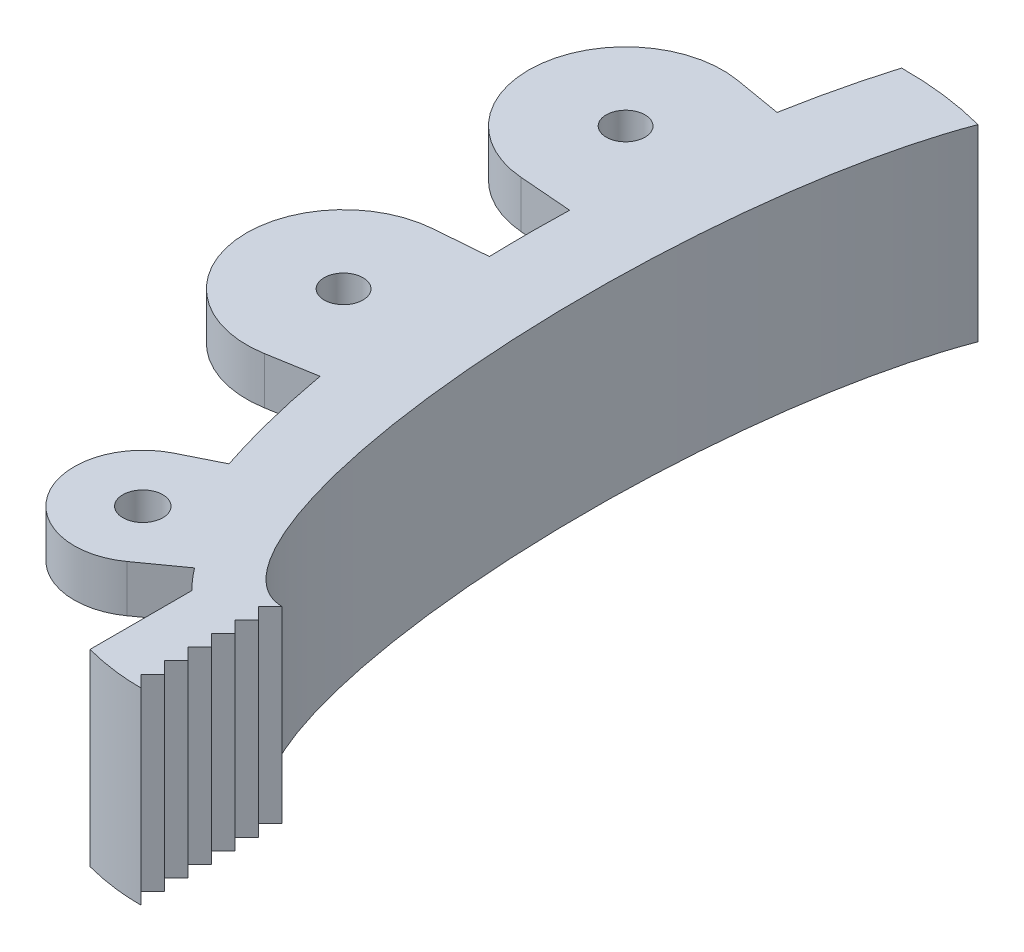
ISO-10303-21;
HEADER;
FILE_DESCRIPTION(('STEP AP214'),'2;1');
FILE_NAME('part.step','',(''),(''),'','','');
FILE_SCHEMA(('AUTOMOTIVE_DESIGN { 1 0 10303 214 1 1 1 1 }'));
ENDSEC;
DATA;
#1=APPLICATION_CONTEXT('core data for automotive mechanical design processes');
#2=APPLICATION_PROTOCOL_DEFINITION('international standard','automotive_design',2000,#1);
#3=PRODUCT_CONTEXT('',#1,'mechanical');
#4=PRODUCT('Part','Part','',(#3));
#5=PRODUCT_RELATED_PRODUCT_CATEGORY('part','',(#4));
#6=PRODUCT_DEFINITION_FORMATION('','',#4);
#7=PRODUCT_DEFINITION_CONTEXT('part definition',#1,'design');
#8=PRODUCT_DEFINITION('design','',#6,#7);
#9=PRODUCT_DEFINITION_SHAPE('','',#8);
#10=(LENGTH_UNIT() NAMED_UNIT(*) SI_UNIT(.MILLI.,.METRE.));
#11=(NAMED_UNIT(*) PLANE_ANGLE_UNIT() SI_UNIT($,.RADIAN.));
#12=(NAMED_UNIT(*) SI_UNIT($,.STERADIAN.) SOLID_ANGLE_UNIT());
#13=UNCERTAINTY_MEASURE_WITH_UNIT(LENGTH_MEASURE(1.E-05),#10,'distance_accuracy_value','');
#14=(GEOMETRIC_REPRESENTATION_CONTEXT(3) GLOBAL_UNCERTAINTY_ASSIGNED_CONTEXT((#13)) GLOBAL_UNIT_ASSIGNED_CONTEXT((#10,
#11,#12)) REPRESENTATION_CONTEXT('',''));
#15=CARTESIAN_POINT('',(0.,0.,0.));
#16=DIRECTION('',(0.,0.,1.));
#17=DIRECTION('',(1.,0.,0.));
#18=AXIS2_PLACEMENT_3D('',#15,#16,#17);
#19=CARTESIAN_POINT('',(0.,4.,0.));
#20=DIRECTION('',(0.,1.,0.));
#21=DIRECTION('',(0.,0.,1.));
#22=AXIS2_PLACEMENT_3D('',#19,#20,#21);
#23=PLANE('',#22);
#24=DIRECTION('',(0.812642963083128,0.,-0.582761884950855));
#25=VECTOR('',#24,1.);
#26=CARTESIAN_POINT('',(-9.89916446848209,4.,41.2779550383489));
#27=LINE('',#26,#25);
#28=CARTESIAN_POINT('',(-9.89916446847095,4.,41.2779550383645));
#29=VERTEX_POINT('',#28);
#30=CARTESIAN_POINT('',(-6.55408620010904,4.,38.8791351315237));
#31=VERTEX_POINT('',#30);
#32=EDGE_CURVE('E156',#29,#31,#27,.T.);
#33=ORIENTED_EDGE('',*,*,#32,.T.);
#34=CARTESIAN_POINT('',(2.02962646689286E-13,4.,2.));
#35=DIRECTION('',(0.,1.,0.));
#36=DIRECTION('',(0.,0.,1.));
#37=AXIS2_PLACEMENT_3D('',#34,#35,#36);
#38=ELLIPSE('',#37,41.,14.9999999999999);
#39=CARTESIAN_POINT('',(-5.00000000000001,4.,40.6551707048646));
#40=VERTEX_POINT('',#39);
#41=EDGE_CURVE('E385',#31,#40,#38,.T.);
#42=ORIENTED_EDGE('',*,*,#41,.T.);
#43=DIRECTION('',(0.,0.,1.));
#44=VECTOR('',#43,1.);
#45=CARTESIAN_POINT('',(-5.,4.,49.3275547212977));
#46=LINE('',#45,#44);
#47=CARTESIAN_POINT('',(-5.00000000000001,4.,49.3275547212978));
#48=VERTEX_POINT('',#47);
#49=EDGE_CURVE('E382',#40,#48,#46,.T.);
#50=ORIENTED_EDGE('',*,*,#49,.T.);
#51=CARTESIAN_POINT('',(2.02962646689286E-13,4.,2.));
#52=DIRECTION('',(0.,1.,0.));
#53=DIRECTION('',(0.,0.,1.));
#54=AXIS2_PLACEMENT_3D('',#51,#52,#53);
#55=ELLIPSE('',#54,48.,29.9759903923123);
#56=CARTESIAN_POINT('',(0.,4.,50.));
#57=VERTEX_POINT('',#56);
#58=EDGE_CURVE('E379',#48,#57,#55,.T.);
#59=ORIENTED_EDGE('',*,*,#58,.T.);
#60=DIRECTION('',(-0.707106781186547,0.,-0.707106781186548));
#61=VECTOR('',#60,1.);
#62=CARTESIAN_POINT('',(0.,4.,50.));
#63=LINE('',#62,#61);
#64=CARTESIAN_POINT('',(-1.,4.,49.));
#65=VERTEX_POINT('',#64);
#66=EDGE_CURVE('E376',#57,#65,#63,.T.);
#67=ORIENTED_EDGE('',*,*,#66,.T.);
#68=DIRECTION('',(0.707106781186547,0.,-0.707106781186548));
#69=VECTOR('',#68,1.);
#70=CARTESIAN_POINT('',(-1.,4.,49.));
#71=LINE('',#70,#69);
#72=CARTESIAN_POINT('',(0.,4.,48.));
#73=VERTEX_POINT('',#72);
#74=EDGE_CURVE('E373',#65,#73,#71,.T.);
#75=ORIENTED_EDGE('',*,*,#74,.T.);
#76=DIRECTION('',(-0.70710678118655,0.,-0.707106781186545));
#77=VECTOR('',#76,1.);
#78=CARTESIAN_POINT('',(0.,4.,48.));
#79=LINE('',#78,#77);
#80=CARTESIAN_POINT('',(-1.00000000000001,4.,47.));
#81=VERTEX_POINT('',#80);
#82=EDGE_CURVE('E370',#73,#81,#79,.T.);
#83=ORIENTED_EDGE('',*,*,#82,.T.);
#84=DIRECTION('',(0.707106781186547,0.,-0.707106781186548));
#85=VECTOR('',#84,1.);
#86=CARTESIAN_POINT('',(-1.00000000000001,4.,47.));
#87=LINE('',#86,#85);
#88=CARTESIAN_POINT('',(0.,4.,46.));
#89=VERTEX_POINT('',#88);
#90=EDGE_CURVE('E367',#81,#89,#87,.T.);
#91=ORIENTED_EDGE('',*,*,#90,.T.);
#92=DIRECTION('',(-0.707106781186552,0.,-0.707106781186543));
#93=VECTOR('',#92,1.);
#94=CARTESIAN_POINT('',(0.,4.,46.));
#95=LINE('',#94,#93);
#96=CARTESIAN_POINT('',(-1.00000000000002,4.,45.));
#97=VERTEX_POINT('',#96);
#98=EDGE_CURVE('E364',#89,#97,#95,.T.);
#99=ORIENTED_EDGE('',*,*,#98,.T.);
#100=DIRECTION('',(0.707106781186547,0.,-0.707106781186548));
#101=VECTOR('',#100,1.);
#102=CARTESIAN_POINT('',(-1.00000000000002,4.,45.));
#103=LINE('',#102,#101);
#104=CARTESIAN_POINT('',(0.,4.,44.));
#105=VERTEX_POINT('',#104);
#106=EDGE_CURVE('E361',#97,#105,#103,.T.);
#107=ORIENTED_EDGE('',*,*,#106,.T.);
#108=DIRECTION('',(-0.70710678118655,0.,-0.707106781186545));
#109=VECTOR('',#108,1.);
#110=CARTESIAN_POINT('',(0.,4.,44.));
#111=LINE('',#110,#109);
#112=CARTESIAN_POINT('',(-1.00000000000002,4.,43.));
#113=VERTEX_POINT('',#112);
#114=EDGE_CURVE('E358',#105,#113,#111,.T.);
#115=ORIENTED_EDGE('',*,*,#114,.T.);
#116=DIRECTION('',(0.707106781186547,0.,-0.707106781186548));
#117=VECTOR('',#116,1.);
#118=CARTESIAN_POINT('',(-1.00000000000002,4.,43.));
#119=LINE('',#118,#117);
#120=CARTESIAN_POINT('',(0.,4.,42.));
#121=VERTEX_POINT('',#120);
#122=EDGE_CURVE('E355',#113,#121,#119,.T.);
#123=ORIENTED_EDGE('',*,*,#122,.T.);
#124=DIRECTION('',(-0.70710678118655,0.,-0.707106781186545));
#125=VECTOR('',#124,1.);
#126=CARTESIAN_POINT('',(0.,4.,42.));
#127=LINE('',#126,#125);
#128=CARTESIAN_POINT('',(-1.00000000000003,4.,41.));
#129=VERTEX_POINT('',#128);
#130=EDGE_CURVE('E352',#121,#129,#127,.T.);
#131=ORIENTED_EDGE('',*,*,#130,.T.);
#132=DIRECTION('',(0.707106781186547,0.,-0.707106781186548));
#133=VECTOR('',#132,1.);
#134=CARTESIAN_POINT('',(-1.00000000000003,4.,41.));
#135=LINE('',#134,#133);
#136=CARTESIAN_POINT('',(0.,4.,40.));
#137=VERTEX_POINT('',#136);
#138=EDGE_CURVE('E349',#129,#137,#135,.T.);
#139=ORIENTED_EDGE('',*,*,#138,.T.);
#140=DIRECTION('',(-0.70710678118655,0.,-0.707106781186545));
#141=VECTOR('',#140,1.);
#142=CARTESIAN_POINT('',(0.,4.,40.));
#143=LINE('',#142,#141);
#144=CARTESIAN_POINT('',(-1.00000000000004,4.,39.));
#145=VERTEX_POINT('',#144);
#146=EDGE_CURVE('E346',#137,#145,#143,.T.);
#147=ORIENTED_EDGE('',*,*,#146,.T.);
#148=DIRECTION('',(0.707106781186566,0.,-0.707106781186529));
#149=VECTOR('',#148,1.);
#150=CARTESIAN_POINT('',(-1.00000000000004,4.,39.));
#151=LINE('',#150,#149);
#152=CARTESIAN_POINT('',(0.,4.,38.));
#153=VERTEX_POINT('',#152);
#154=EDGE_CURVE('E343',#145,#153,#151,.T.);
#155=ORIENTED_EDGE('',*,*,#154,.T.);
#156=CARTESIAN_POINT('',(2.02962646689286E-13,4.,2.));
#157=DIRECTION('',(0.,-1.,0.));
#158=DIRECTION('',(0.,0.,1.));
#159=AXIS2_PLACEMENT_3D('',#156,#157,#158);
#160=ELLIPSE('',#159,36.,10.);
#161=CARTESIAN_POINT('',(-5.89365223515134,4.,-27.0832018314858));
#162=VERTEX_POINT('',#161);
#163=EDGE_CURVE('E340',#153,#162,#160,.T.);
#164=ORIENTED_EDGE('',*,*,#163,.T.);
#165=CARTESIAN_POINT('',(-13.,4.,4.50401092710764E-13));
#166=DIRECTION('',(0.,1.,0.));
#167=DIRECTION('',(0.,0.,1.));
#168=AXIS2_PLACEMENT_3D('',#165,#166,#167);
#169=CIRCLE('',#168,28.0000000000178);
#170=CARTESIAN_POINT('',(-13.3088025963939,4.,-27.9982971081713));
#171=VERTEX_POINT('',#170);
#172=EDGE_CURVE('E108',#162,#171,#169,.T.);
#173=ORIENTED_EDGE('',*,*,#172,.T.);
#174=CARTESIAN_POINT('',(0.,4.,0.));
#175=DIRECTION('',(0.,1.,0.));
#176=DIRECTION('',(0.,0.,1.));
#177=AXIS2_PLACEMENT_3D('',#174,#175,#176);
#178=ELLIPSE('',#177,45.,17.);
#179=CARTESIAN_POINT('',(-15.3330618466495,4.,-19.4333088266233));
#180=VERTEX_POINT('',#179);
#181=EDGE_CURVE('E217',#171,#180,#178,.T.);
#182=ORIENTED_EDGE('',*,*,#181,.T.);
#183=DIRECTION('',(-0.985692604134485,0.,-0.168552929830889));
#184=VECTOR('',#183,1.);
#185=CARTESIAN_POINT('',(-19.381931406796,4.,-20.1256634450949));
#186=LINE('',#185,#184);
#187=CARTESIAN_POINT('',(-19.381931406796,4.,-20.1256634450949));
#188=VERTEX_POINT('',#187);
#189=EDGE_CURVE('E239',#180,#188,#186,.T.);
#190=ORIENTED_EDGE('',*,*,#189,.T.);
#191=CARTESIAN_POINT('',(-20.7726012422298,4.,-11.99306691897));
#192=DIRECTION('',(0.,1.,0.));
#193=DIRECTION('',(0.,0.,1.));
#194=AXIS2_PLACEMENT_3D('',#191,#192,#193);
#195=CIRCLE('',#194,8.25064172339411);
#196=CARTESIAN_POINT('',(-21.4292742813688,4.,-3.76859919348893));
#197=VERTEX_POINT('',#196);
#198=EDGE_CURVE('E236',#188,#197,#195,.T.);
#199=ORIENTED_EDGE('',*,*,#198,.T.);
#200=DIRECTION('',(0.996827640953239,0.,0.0795905410937763));
#201=VECTOR('',#200,1.);
#202=CARTESIAN_POINT('',(-21.4292742813682,4.,-3.76859919349572));
#203=LINE('',#202,#201);
#204=CARTESIAN_POINT('',(-16.9510904478519,4.,-3.41104382506098));
#205=VERTEX_POINT('',#204);
#206=EDGE_CURVE('E238',#197,#205,#203,.T.);
#207=ORIENTED_EDGE('',*,*,#206,.T.);
#208=CARTESIAN_POINT('',(0.,4.,0.));
#209=DIRECTION('',(0.,1.,0.));
#210=DIRECTION('',(0.,0.,1.));
#211=AXIS2_PLACEMENT_3D('',#208,#209,#210);
#212=ELLIPSE('',#211,45.,17.);
#213=CARTESIAN_POINT('',(-16.9510904478519,4.,3.41104382506229));
#214=VERTEX_POINT('',#213);
#215=EDGE_CURVE('E241',#205,#214,#212,.T.);
#216=ORIENTED_EDGE('',*,*,#215,.T.);
#217=DIRECTION('',(-0.996827640953238,0.,0.0795905410937935));
#218=VECTOR('',#217,1.);
#219=CARTESIAN_POINT('',(-21.4292742813682,4.,3.7685991934971));
#220=LINE('',#219,#218);
#221=CARTESIAN_POINT('',(-21.4292742813682,4.,3.7685991934971));
#222=VERTEX_POINT('',#221);
#223=EDGE_CURVE('E248',#214,#222,#220,.T.);
#224=ORIENTED_EDGE('',*,*,#223,.T.);
#225=CARTESIAN_POINT('',(-20.7726012422296,4.,11.9930669189713));
#226=DIRECTION('',(0.,1.,0.));
#227=DIRECTION('',(0.,0.,1.));
#228=AXIS2_PLACEMENT_3D('',#225,#226,#227);
#229=CIRCLE('',#228,8.25064172339408);
#230=CARTESIAN_POINT('',(-19.3819314067968,4.,20.1256634450895));
#231=VERTEX_POINT('',#230);
#232=EDGE_CURVE('E577',#222,#231,#229,.T.);
#233=ORIENTED_EDGE('',*,*,#232,.T.);
#234=DIRECTION('',(0.985692604134482,0.,-0.16855292983091));
#235=VECTOR('',#234,1.);
#236=CARTESIAN_POINT('',(-19.3819314067957,4.,20.1256634450962));
#237=LINE('',#236,#235);
#238=CARTESIAN_POINT('',(-15.3330618466493,4.,19.4333088266245));
#239=VERTEX_POINT('',#238);
#240=EDGE_CURVE('E142',#231,#239,#237,.T.);
#241=ORIENTED_EDGE('',*,*,#240,.T.);
#242=CARTESIAN_POINT('',(0.,4.,0.));
#243=DIRECTION('',(0.,1.,0.));
#244=DIRECTION('',(0.,0.,1.));
#245=AXIS2_PLACEMENT_3D('',#242,#243,#244);
#246=ELLIPSE('',#245,45.,17.);
#247=CARTESIAN_POINT('',(-12.7538354502232,4.,29.753186253147));
#248=VERTEX_POINT('',#247);
#249=EDGE_CURVE('E136',#239,#248,#246,.T.);
#250=ORIENTED_EDGE('',*,*,#249,.T.);
#251=DIRECTION('',(-0.89554192965908,0.,0.444977136741306));
#252=VECTOR('',#251,1.);
#253=CARTESIAN_POINT('',(-15.8942706000473,4.,31.3136065917261));
#254=LINE('',#253,#252);
#255=CARTESIAN_POINT('',(-15.8942706000473,4.,31.3136065917261));
#256=VERTEX_POINT('',#255);
#257=EDGE_CURVE('E140',#248,#256,#254,.T.);
#258=ORIENTED_EDGE('',*,*,#257,.T.);
#259=CARTESIAN_POINT('',(-13.2985871584458,4.,36.5375679284797));
#260=DIRECTION('',(0.,1.,0.));
#261=DIRECTION('',(0.,0.,1.));
#262=AXIS2_PLACEMENT_3D('',#259,#260,#261);
#263=CIRCLE('',#262,5.83329620169225);
#264=EDGE_CURVE('E52',#256,#29,#263,.T.);
#265=ORIENTED_EDGE('',*,*,#264,.T.);
#266=EDGE_LOOP('',(#33,#42,#50,#59,#67,#75,#83,#91,#99,#107,#115,#123,#131,#139,#147,#155,#164,
#173,#182,#190,#199,#207,#216,#224,#233,#241,#250,#258,#265));
#267=FACE_BOUND('',#266,.T.);
#268=CARTESIAN_POINT('',(-20.7726012422298,4.,-11.99306691897));
#269=DIRECTION('',(0.,1.,0.));
#270=DIRECTION('',(0.,0.,1.));
#271=AXIS2_PLACEMENT_3D('',#268,#269,#270);
#272=CIRCLE('',#271,1.65000000000002);
#273=CARTESIAN_POINT('',(-20.7726012422298,4.,-10.34306691897));
#274=VERTEX_POINT('',#273);
#275=EDGE_CURVE('E272',#274,#274,#272,.T.);
#276=ORIENTED_EDGE('',*,*,#275,.F.);
#277=EDGE_LOOP('',(#276));
#278=FACE_BOUND('',#277,.T.);
#279=CARTESIAN_POINT('',(-13.2985871584458,4.,36.5375679284797));
#280=DIRECTION('',(0.,1.,0.));
#281=DIRECTION('',(0.,0.,1.));
#282=AXIS2_PLACEMENT_3D('',#279,#280,#281);
#283=CIRCLE('',#282,1.7);
#284=CARTESIAN_POINT('',(-13.2985871584458,4.,38.2375679284797));
#285=VERTEX_POINT('',#284);
#286=EDGE_CURVE('E166',#285,#285,#283,.T.);
#287=ORIENTED_EDGE('',*,*,#286,.F.);
#288=EDGE_LOOP('',(#287));
#289=FACE_BOUND('',#288,.T.);
#290=CARTESIAN_POINT('',(-20.7726012422296,4.,11.9930669189713));
#291=DIRECTION('',(0.,1.,0.));
#292=DIRECTION('',(0.,0.,1.));
#293=AXIS2_PLACEMENT_3D('',#290,#291,#292);
#294=CIRCLE('',#293,1.65000000000018);
#295=CARTESIAN_POINT('',(-20.7726012422296,4.,13.6430669189715));
#296=VERTEX_POINT('',#295);
#297=EDGE_CURVE('E278',#296,#296,#294,.T.);
#298=ORIENTED_EDGE('',*,*,#297,.F.);
#299=EDGE_LOOP('',(#298));
#300=FACE_BOUND('',#299,.T.);
#301=ADVANCED_FACE('F35',(#267,#278,#289,#300),#23,.T.);
#302=CARTESIAN_POINT('',(0.,0.,0.));
#303=DIRECTION('',(0.,1.,0.));
#304=DIRECTION('',(0.,0.,1.));
#305=AXIS2_PLACEMENT_3D('',#302,#303,#304);
#306=PLANE('',#305);
#307=CARTESIAN_POINT('',(-13.,0.,4.50401092710764E-13));
#308=DIRECTION('',(0.,1.,0.));
#309=DIRECTION('',(0.,0.,1.));
#310=AXIS2_PLACEMENT_3D('',#307,#308,#309);
#311=CIRCLE('',#310,28.0000000000178);
#312=CARTESIAN_POINT('',(-10.2761925182706,0.,-27.867200663189));
#313=VERTEX_POINT('',#312);
#314=CARTESIAN_POINT('',(-13.3088025963939,0.,-27.9982971081713));
#315=VERTEX_POINT('',#314);
#316=EDGE_CURVE('E163',#313,#315,#311,.T.);
#317=ORIENTED_EDGE('',*,*,#316,.F.);
#318=CARTESIAN_POINT('',(2.02962646689286E-13,0.,2.));
#319=DIRECTION('',(0.,1.,0.));
#320=DIRECTION('',(0.,0.,1.));
#321=AXIS2_PLACEMENT_3D('',#318,#319,#320);
#322=ELLIPSE('',#321,41.,14.9999999999999);
#323=CARTESIAN_POINT('',(-6.55408620010904,0.,38.8791351315237));
#324=VERTEX_POINT('',#323);
#325=EDGE_CURVE('E284',#313,#324,#322,.T.);
#326=ORIENTED_EDGE('',*,*,#325,.T.);
#327=DIRECTION('',(0.812642963083128,0.,-0.582761884950855));
#328=VECTOR('',#327,1.);
#329=CARTESIAN_POINT('',(-9.89916446848209,0.,41.2779550383489));
#330=LINE('',#329,#328);
#331=CARTESIAN_POINT('',(-9.89916446847095,0.,41.2779550383645));
#332=VERTEX_POINT('',#331);
#333=EDGE_CURVE('E185',#332,#324,#330,.T.);
#334=ORIENTED_EDGE('',*,*,#333,.F.);
#335=CARTESIAN_POINT('',(-13.2985871584458,0.,36.5375679284797));
#336=DIRECTION('',(0.,1.,0.));
#337=DIRECTION('',(0.,0.,1.));
#338=AXIS2_PLACEMENT_3D('',#335,#336,#337);
#339=CIRCLE('',#338,5.83329620169225);
#340=CARTESIAN_POINT('',(-15.8942706000473,0.,31.3136065917261));
#341=VERTEX_POINT('',#340);
#342=EDGE_CURVE('E100',#341,#332,#339,.T.);
#343=ORIENTED_EDGE('',*,*,#342,.F.);
#344=DIRECTION('',(-0.89554192965908,0.,0.444977136741306));
#345=VECTOR('',#344,1.);
#346=CARTESIAN_POINT('',(-15.8942706000473,0.,31.3136065917261));
#347=LINE('',#346,#345);
#348=CARTESIAN_POINT('',(-12.7538354502232,0.,29.753186253147));
#349=VERTEX_POINT('',#348);
#350=EDGE_CURVE('E94',#349,#341,#347,.T.);
#351=ORIENTED_EDGE('',*,*,#350,.F.);
#352=CARTESIAN_POINT('',(0.,0.,0.));
#353=DIRECTION('',(0.,1.,0.));
#354=DIRECTION('',(0.,0.,1.));
#355=AXIS2_PLACEMENT_3D('',#352,#353,#354);
#356=ELLIPSE('',#355,45.,17.);
#357=CARTESIAN_POINT('',(-15.3330618466493,0.,19.4333088266245));
#358=VERTEX_POINT('',#357);
#359=EDGE_CURVE('E150',#358,#349,#356,.T.);
#360=ORIENTED_EDGE('',*,*,#359,.F.);
#361=DIRECTION('',(0.985692604134482,0.,-0.16855292983091));
#362=VECTOR('',#361,1.);
#363=CARTESIAN_POINT('',(-19.3819314067957,0.,20.1256634450962));
#364=LINE('',#363,#362);
#365=CARTESIAN_POINT('',(-19.3819314067968,0.,20.1256634450895));
#366=VERTEX_POINT('',#365);
#367=EDGE_CURVE('E180',#366,#358,#364,.T.);
#368=ORIENTED_EDGE('',*,*,#367,.F.);
#369=CARTESIAN_POINT('',(-20.7726012422296,0.,11.9930669189713));
#370=DIRECTION('',(0.,1.,0.));
#371=DIRECTION('',(0.,0.,1.));
#372=AXIS2_PLACEMENT_3D('',#369,#370,#371);
#373=CIRCLE('',#372,8.25064172339408);
#374=CARTESIAN_POINT('',(-21.4292742813682,0.,3.7685991934971));
#375=VERTEX_POINT('',#374);
#376=EDGE_CURVE('E178',#375,#366,#373,.T.);
#377=ORIENTED_EDGE('',*,*,#376,.F.);
#378=DIRECTION('',(-0.996827640953238,0.,0.0795905410937935));
#379=VECTOR('',#378,1.);
#380=CARTESIAN_POINT('',(-21.4292742813682,0.,3.7685991934971));
#381=LINE('',#380,#379);
#382=CARTESIAN_POINT('',(-16.9510904478519,0.,3.41104382506229));
#383=VERTEX_POINT('',#382);
#384=EDGE_CURVE('E176',#383,#375,#381,.T.);
#385=ORIENTED_EDGE('',*,*,#384,.F.);
#386=CARTESIAN_POINT('',(0.,0.,0.));
#387=DIRECTION('',(0.,1.,0.));
#388=DIRECTION('',(0.,0.,1.));
#389=AXIS2_PLACEMENT_3D('',#386,#387,#388);
#390=ELLIPSE('',#389,45.,17.);
#391=CARTESIAN_POINT('',(-16.9510904478519,0.,-3.41104382506098));
#392=VERTEX_POINT('',#391);
#393=EDGE_CURVE('E174',#392,#383,#390,.T.);
#394=ORIENTED_EDGE('',*,*,#393,.F.);
#395=DIRECTION('',(0.996827640953239,0.,0.0795905410937763));
#396=VECTOR('',#395,1.);
#397=CARTESIAN_POINT('',(-21.4292742813682,0.,-3.76859919349572));
#398=LINE('',#397,#396);
#399=CARTESIAN_POINT('',(-21.4292742813688,0.,-3.76859919348893));
#400=VERTEX_POINT('',#399);
#401=EDGE_CURVE('E172',#400,#392,#398,.T.);
#402=ORIENTED_EDGE('',*,*,#401,.F.);
#403=CARTESIAN_POINT('',(-20.7726012422298,0.,-11.99306691897));
#404=DIRECTION('',(0.,1.,0.));
#405=DIRECTION('',(0.,0.,1.));
#406=AXIS2_PLACEMENT_3D('',#403,#404,#405);
#407=CIRCLE('',#406,8.25064172339411);
#408=CARTESIAN_POINT('',(-19.381931406796,0.,-20.1256634450949));
#409=VERTEX_POINT('',#408);
#410=EDGE_CURVE('E170',#409,#400,#407,.T.);
#411=ORIENTED_EDGE('',*,*,#410,.F.);
#412=DIRECTION('',(-0.985692604134485,0.,-0.168552929830889));
#413=VECTOR('',#412,1.);
#414=CARTESIAN_POINT('',(-19.381931406796,0.,-20.1256634450949));
#415=LINE('',#414,#413);
#416=CARTESIAN_POINT('',(-15.3330618466495,0.,-19.4333088266233));
#417=VERTEX_POINT('',#416);
#418=EDGE_CURVE('E168',#417,#409,#415,.T.);
#419=ORIENTED_EDGE('',*,*,#418,.F.);
#420=CARTESIAN_POINT('',(0.,0.,0.));
#421=DIRECTION('',(0.,1.,0.));
#422=DIRECTION('',(0.,0.,1.));
#423=AXIS2_PLACEMENT_3D('',#420,#421,#422);
#424=ELLIPSE('',#423,45.,17.);
#425=EDGE_CURVE('E165',#315,#417,#424,.T.);
#426=ORIENTED_EDGE('',*,*,#425,.F.);
#427=EDGE_LOOP('',(#317,#326,#334,#343,#351,#360,#368,#377,#385,#394,#402,#411,#419,#426));
#428=FACE_BOUND('',#427,.T.);
#429=CARTESIAN_POINT('',(-13.2985871584458,0.,36.5375679284797));
#430=DIRECTION('',(0.,1.,0.));
#431=DIRECTION('',(0.,0.,1.));
#432=AXIS2_PLACEMENT_3D('',#429,#430,#431);
#433=CIRCLE('',#432,1.7);
#434=CARTESIAN_POINT('',(-13.2985871584458,0.,38.2375679284797));
#435=VERTEX_POINT('',#434);
#436=EDGE_CURVE('E269',#435,#435,#433,.T.);
#437=ORIENTED_EDGE('',*,*,#436,.T.);
#438=EDGE_LOOP('',(#437));
#439=FACE_BOUND('',#438,.T.);
#440=CARTESIAN_POINT('',(-20.7726012422298,0.,-11.99306691897));
#441=DIRECTION('',(0.,1.,0.));
#442=DIRECTION('',(0.,0.,1.));
#443=AXIS2_PLACEMENT_3D('',#440,#441,#442);
#444=CIRCLE('',#443,1.65000000000002);
#445=CARTESIAN_POINT('',(-20.7726012422298,0.,-10.34306691897));
#446=VERTEX_POINT('',#445);
#447=EDGE_CURVE('E275',#446,#446,#444,.T.);
#448=ORIENTED_EDGE('',*,*,#447,.T.);
#449=EDGE_LOOP('',(#448));
#450=FACE_BOUND('',#449,.T.);
#451=CARTESIAN_POINT('',(-20.7726012422296,0.,11.9930669189713));
#452=DIRECTION('',(0.,1.,0.));
#453=DIRECTION('',(0.,0.,1.));
#454=AXIS2_PLACEMENT_3D('',#451,#452,#453);
#455=CIRCLE('',#454,1.65000000000018);
#456=CARTESIAN_POINT('',(-20.7726012422296,0.,13.6430669189715));
#457=VERTEX_POINT('',#456);
#458=EDGE_CURVE('E281',#457,#457,#455,.T.);
#459=ORIENTED_EDGE('',*,*,#458,.T.);
#460=EDGE_LOOP('',(#459));
#461=FACE_BOUND('',#460,.T.);
#462=ADVANCED_FACE('F222',(#428,#439,#450,#461),#306,.F.);
#463=CARTESIAN_POINT('',(-13.,4.,4.50401092710764E-13));
#464=DIRECTION('',(0.,-1.,0.));
#465=DIRECTION('',(0.,0.,-1.));
#466=AXIS2_PLACEMENT_3D('',#463,#464,#465);
#467=CYLINDRICAL_SURFACE('',#466,28.0000000000178);
#468=DIRECTION('',(0.,1.,0.));
#469=VECTOR('',#468,1.);
#470=CARTESIAN_POINT('',(-10.2761925182706,-12.,-27.867200663189));
#471=LINE('',#470,#469);
#472=CARTESIAN_POINT('',(-10.2761925182706,-12.,-27.867200663189));
#473=VERTEX_POINT('',#472);
#474=EDGE_CURVE('E288',#473,#313,#471,.T.);
#475=ORIENTED_EDGE('',*,*,#474,.T.);
#476=ORIENTED_EDGE('',*,*,#316,.T.);
#477=DIRECTION('',(0.,-1.,0.));
#478=VECTOR('',#477,1.);
#479=CARTESIAN_POINT('',(-13.3088025963939,4.,-27.9982971081713));
#480=LINE('',#479,#478);
#481=EDGE_CURVE('E44',#171,#315,#480,.T.);
#482=ORIENTED_EDGE('',*,*,#481,.F.);
#483=ORIENTED_EDGE('',*,*,#172,.F.);
#484=DIRECTION('',(0.,1.,0.));
#485=VECTOR('',#484,1.);
#486=CARTESIAN_POINT('',(-5.89365223515134,-12.,-27.0832018314858));
#487=LINE('',#486,#485);
#488=CARTESIAN_POINT('',(-5.89365223515134,-12.,-27.0832018314858));
#489=VERTEX_POINT('',#488);
#490=EDGE_CURVE('E335',#489,#162,#487,.T.);
#491=ORIENTED_EDGE('',*,*,#490,.F.);
#492=CARTESIAN_POINT('',(-13.,-12.,4.50401092710764E-13));
#493=DIRECTION('',(0.,1.,0.));
#494=DIRECTION('',(0.,0.,-1.));
#495=AXIS2_PLACEMENT_3D('',#492,#493,#494);
#496=CIRCLE('',#495,27.9999999999998);
#497=EDGE_CURVE('E293',#489,#473,#496,.T.);
#498=ORIENTED_EDGE('',*,*,#497,.T.);
#499=EDGE_LOOP('',(#475,#476,#482,#483,#491,#498));
#500=FACE_BOUND('',#499,.T.);
#501=ADVANCED_FACE('F37',(#500),#467,.T.);
#502=DIRECTION('',(0.,-1.,0.));
#503=VECTOR('',#502,1.);
#504=SURFACE_OF_LINEAR_EXTRUSION('',#178,#503);
#505=ORIENTED_EDGE('',*,*,#425,.T.);
#506=DIRECTION('',(0.,-1.,0.));
#507=VECTOR('',#506,1.);
#508=CARTESIAN_POINT('',(-15.3330618466495,4.,-19.4333088266233));
#509=LINE('',#508,#507);
#510=EDGE_CURVE('E209',#180,#417,#509,.T.);
#511=ORIENTED_EDGE('',*,*,#510,.F.);
#512=ORIENTED_EDGE('',*,*,#181,.F.);
#513=ORIENTED_EDGE('',*,*,#481,.T.);
#514=EDGE_LOOP('',(#505,#511,#512,#513));
#515=FACE_BOUND('',#514,.T.);
#516=ADVANCED_FACE('F215',(#515),#504,.F.);
#517=CARTESIAN_POINT('',(-19.381931406796,4.,-20.1256634450949));
#518=DIRECTION('',(-0.168552929830889,0.,0.985692604134485));
#519=DIRECTION('',(0.985692604134486,0.,0.168552929830889));
#520=AXIS2_PLACEMENT_3D('',#517,#518,#519);
#521=PLANE('',#520);
#522=ORIENTED_EDGE('',*,*,#418,.T.);
#523=DIRECTION('',(0.,-1.,0.));
#524=VECTOR('',#523,1.);
#525=CARTESIAN_POINT('',(-19.381931406796,4.,-20.1256634450949));
#526=LINE('',#525,#524);
#527=EDGE_CURVE('E206',#188,#409,#526,.T.);
#528=ORIENTED_EDGE('',*,*,#527,.F.);
#529=ORIENTED_EDGE('',*,*,#189,.F.);
#530=ORIENTED_EDGE('',*,*,#510,.T.);
#531=EDGE_LOOP('',(#522,#528,#529,#530));
#532=FACE_BOUND('',#531,.T.);
#533=ADVANCED_FACE('F230',(#532),#521,.F.);
#534=CARTESIAN_POINT('',(-20.7726012422298,4.,-11.99306691897));
#535=DIRECTION('',(0.,-1.,0.));
#536=DIRECTION('',(0.,0.,-1.));
#537=AXIS2_PLACEMENT_3D('',#534,#535,#536);
#538=CYLINDRICAL_SURFACE('',#537,8.25064172339411);
#539=ORIENTED_EDGE('',*,*,#410,.T.);
#540=DIRECTION('',(0.,-1.,0.));
#541=VECTOR('',#540,1.);
#542=CARTESIAN_POINT('',(-21.4292742813688,4.,-3.76859919348893));
#543=LINE('',#542,#541);
#544=EDGE_CURVE('E203',#197,#400,#543,.T.);
#545=ORIENTED_EDGE('',*,*,#544,.F.);
#546=ORIENTED_EDGE('',*,*,#198,.F.);
#547=ORIENTED_EDGE('',*,*,#527,.T.);
#548=EDGE_LOOP('',(#539,#545,#546,#547));
#549=FACE_BOUND('',#548,.T.);
#550=ADVANCED_FACE('F234',(#549),#538,.T.);
#551=CARTESIAN_POINT('',(-21.4292742813682,4.,-3.76859919349572));
#552=DIRECTION('',(0.0795905410937763,0.,-0.996827640953239));
#553=DIRECTION('',(-0.996827640953239,0.,-0.0795905410937763));
#554=AXIS2_PLACEMENT_3D('',#551,#552,#553);
#555=PLANE('',#554);
#556=ORIENTED_EDGE('',*,*,#401,.T.);
#557=DIRECTION('',(0.,-1.,0.));
#558=VECTOR('',#557,1.);
#559=CARTESIAN_POINT('',(-16.9510904478519,4.,-3.41104382506098));
#560=LINE('',#559,#558);
#561=EDGE_CURVE('E200',#205,#392,#560,.T.);
#562=ORIENTED_EDGE('',*,*,#561,.F.);
#563=ORIENTED_EDGE('',*,*,#206,.F.);
#564=ORIENTED_EDGE('',*,*,#544,.T.);
#565=EDGE_LOOP('',(#556,#562,#563,#564));
#566=FACE_BOUND('',#565,.T.);
#567=ADVANCED_FACE('F256',(#566),#555,.F.);
#568=DIRECTION('',(0.,-1.,0.));
#569=VECTOR('',#568,1.);
#570=SURFACE_OF_LINEAR_EXTRUSION('',#212,#569);
#571=ORIENTED_EDGE('',*,*,#393,.T.);
#572=DIRECTION('',(0.,-1.,0.));
#573=VECTOR('',#572,1.);
#574=CARTESIAN_POINT('',(-16.9510904478519,4.,3.41104382506229));
#575=LINE('',#574,#573);
#576=EDGE_CURVE('E197',#214,#383,#575,.T.);
#577=ORIENTED_EDGE('',*,*,#576,.F.);
#578=ORIENTED_EDGE('',*,*,#215,.F.);
#579=ORIENTED_EDGE('',*,*,#561,.T.);
#580=EDGE_LOOP('',(#571,#577,#578,#579));
#581=FACE_BOUND('',#580,.T.);
#582=ADVANCED_FACE('F251',(#581),#570,.F.);
#583=CARTESIAN_POINT('',(-21.4292742813682,4.,3.7685991934971));
#584=DIRECTION('',(0.0795905410937935,0.,0.996827640953238));
#585=DIRECTION('',(0.996827640953238,0.,-0.0795905410937935));
#586=AXIS2_PLACEMENT_3D('',#583,#584,#585);
#587=PLANE('',#586);
#588=ORIENTED_EDGE('',*,*,#384,.T.);
#589=DIRECTION('',(0.,-1.,0.));
#590=VECTOR('',#589,1.);
#591=CARTESIAN_POINT('',(-21.4292742813682,4.,3.7685991934971));
#592=LINE('',#591,#590);
#593=EDGE_CURVE('E194',#222,#375,#592,.T.);
#594=ORIENTED_EDGE('',*,*,#593,.F.);
#595=ORIENTED_EDGE('',*,*,#223,.F.);
#596=ORIENTED_EDGE('',*,*,#576,.T.);
#597=EDGE_LOOP('',(#588,#594,#595,#596));
#598=FACE_BOUND('',#597,.T.);
#599=ADVANCED_FACE('F255',(#598),#587,.F.);
#600=CARTESIAN_POINT('',(-20.7726012422296,4.,11.9930669189713));
#601=DIRECTION('',(0.,-1.,0.));
#602=DIRECTION('',(0.,0.,-1.));
#603=AXIS2_PLACEMENT_3D('',#600,#601,#602);
#604=CYLINDRICAL_SURFACE('',#603,8.25064172339408);
#605=ORIENTED_EDGE('',*,*,#376,.T.);
#606=DIRECTION('',(0.,-1.,0.));
#607=VECTOR('',#606,1.);
#608=CARTESIAN_POINT('',(-19.3819314067968,4.,20.1256634450895));
#609=LINE('',#608,#607);
#610=EDGE_CURVE('E191',#231,#366,#609,.T.);
#611=ORIENTED_EDGE('',*,*,#610,.F.);
#612=ORIENTED_EDGE('',*,*,#232,.F.);
#613=ORIENTED_EDGE('',*,*,#593,.T.);
#614=EDGE_LOOP('',(#605,#611,#612,#613));
#615=FACE_BOUND('',#614,.T.);
#616=ADVANCED_FACE('F576',(#615),#604,.T.);
#617=CARTESIAN_POINT('',(-19.3819314067957,4.,20.1256634450962));
#618=DIRECTION('',(-0.16855292983091,0.,-0.985692604134482));
#619=DIRECTION('',(-0.985692604134482,0.,0.16855292983091));
#620=AXIS2_PLACEMENT_3D('',#617,#618,#619);
#621=PLANE('',#620);
#622=ORIENTED_EDGE('',*,*,#367,.T.);
#623=DIRECTION('',(0.,-1.,0.));
#624=VECTOR('',#623,1.);
#625=CARTESIAN_POINT('',(-15.3330618466493,4.,19.4333088266245));
#626=LINE('',#625,#624);
#627=EDGE_CURVE('E151',#239,#358,#626,.T.);
#628=ORIENTED_EDGE('',*,*,#627,.F.);
#629=ORIENTED_EDGE('',*,*,#240,.F.);
#630=ORIENTED_EDGE('',*,*,#610,.T.);
#631=EDGE_LOOP('',(#622,#628,#629,#630));
#632=FACE_BOUND('',#631,.T.);
#633=ADVANCED_FACE('F572',(#632),#621,.F.);
#634=DIRECTION('',(0.,-1.,0.));
#635=VECTOR('',#634,1.);
#636=SURFACE_OF_LINEAR_EXTRUSION('',#246,#635);
#637=ORIENTED_EDGE('',*,*,#359,.T.);
#638=DIRECTION('',(0.,-1.,0.));
#639=VECTOR('',#638,1.);
#640=CARTESIAN_POINT('',(-12.7538354502232,4.,29.753186253147));
#641=LINE('',#640,#639);
#642=EDGE_CURVE('E147',#248,#349,#641,.T.);
#643=ORIENTED_EDGE('',*,*,#642,.F.);
#644=ORIENTED_EDGE('',*,*,#249,.F.);
#645=ORIENTED_EDGE('',*,*,#627,.T.);
#646=EDGE_LOOP('',(#637,#643,#644,#645));
#647=FACE_BOUND('',#646,.T.);
#648=ADVANCED_FACE('F148',(#647),#636,.F.);
#649=CARTESIAN_POINT('',(-15.8942706000473,4.,31.3136065917261));
#650=DIRECTION('',(0.444977136741306,0.,0.89554192965908));
#651=DIRECTION('',(0.89554192965908,0.,-0.444977136741306));
#652=AXIS2_PLACEMENT_3D('',#649,#650,#651);
#653=PLANE('',#652);
#654=ORIENTED_EDGE('',*,*,#350,.T.);
#655=DIRECTION('',(0.,-1.,0.));
#656=VECTOR('',#655,1.);
#657=CARTESIAN_POINT('',(-15.8942706000473,4.,31.3136065917261));
#658=LINE('',#657,#656);
#659=EDGE_CURVE('E152',#256,#341,#658,.T.);
#660=ORIENTED_EDGE('',*,*,#659,.F.);
#661=ORIENTED_EDGE('',*,*,#257,.F.);
#662=ORIENTED_EDGE('',*,*,#642,.T.);
#663=EDGE_LOOP('',(#654,#660,#661,#662));
#664=FACE_BOUND('',#663,.T.);
#665=ADVANCED_FACE('F154',(#664),#653,.F.);
#666=CARTESIAN_POINT('',(-13.2985871584458,4.,36.5375679284797));
#667=DIRECTION('',(0.,-1.,0.));
#668=DIRECTION('',(0.,0.,-1.));
#669=AXIS2_PLACEMENT_3D('',#666,#667,#668);
#670=CYLINDRICAL_SURFACE('',#669,5.83329620169225);
#671=ORIENTED_EDGE('',*,*,#342,.T.);
#672=DIRECTION('',(0.,-1.,0.));
#673=VECTOR('',#672,1.);
#674=CARTESIAN_POINT('',(-9.89916446847095,4.,41.2779550383645));
#675=LINE('',#674,#673);
#676=EDGE_CURVE('E162',#29,#332,#675,.T.);
#677=ORIENTED_EDGE('',*,*,#676,.F.);
#678=ORIENTED_EDGE('',*,*,#264,.F.);
#679=ORIENTED_EDGE('',*,*,#659,.T.);
#680=EDGE_LOOP('',(#671,#677,#678,#679));
#681=FACE_BOUND('',#680,.T.);
#682=ADVANCED_FACE('F567',(#681),#670,.T.);
#683=CARTESIAN_POINT('',(-9.89916446848209,4.,41.2779550383489));
#684=DIRECTION('',(-0.582761884950855,0.,-0.812642963083128));
#685=DIRECTION('',(-0.812642963083128,0.,0.582761884950855));
#686=AXIS2_PLACEMENT_3D('',#683,#684,#685);
#687=PLANE('',#686);
#688=ORIENTED_EDGE('',*,*,#333,.T.);
#689=DIRECTION('',(0.,1.,0.));
#690=VECTOR('',#689,1.);
#691=CARTESIAN_POINT('',(-6.55408620010904,-12.,38.8791351315237));
#692=LINE('',#691,#690);
#693=EDGE_CURVE('E11',#324,#31,#692,.T.);
#694=ORIENTED_EDGE('',*,*,#693,.T.);
#695=ORIENTED_EDGE('',*,*,#32,.F.);
#696=ORIENTED_EDGE('',*,*,#676,.T.);
#697=EDGE_LOOP('',(#688,#694,#695,#696));
#698=FACE_BOUND('',#697,.T.);
#699=ADVANCED_FACE('F566',(#698),#687,.F.);
#700=CARTESIAN_POINT('',(-13.2985871584458,4.,36.5375679284797));
#701=DIRECTION('',(0.,-1.,0.));
#702=DIRECTION('',(0.,0.,-1.));
#703=AXIS2_PLACEMENT_3D('',#700,#701,#702);
#704=CYLINDRICAL_SURFACE('',#703,1.7);
#705=ORIENTED_EDGE('',*,*,#286,.T.);
#706=EDGE_LOOP('',(#705));
#707=FACE_BOUND('',#706,.T.);
#708=ORIENTED_EDGE('',*,*,#436,.F.);
#709=EDGE_LOOP('',(#708));
#710=FACE_BOUND('',#709,.T.);
#711=ADVANCED_FACE('F596',(#707,#710),#704,.F.);
#712=CARTESIAN_POINT('',(-20.7726012422298,4.,-11.99306691897));
#713=DIRECTION('',(0.,-1.,0.));
#714=DIRECTION('',(0.,0.,-1.));
#715=AXIS2_PLACEMENT_3D('',#712,#713,#714);
#716=CYLINDRICAL_SURFACE('',#715,1.65000000000002);
#717=ORIENTED_EDGE('',*,*,#275,.T.);
#718=EDGE_LOOP('',(#717));
#719=FACE_BOUND('',#718,.T.);
#720=ORIENTED_EDGE('',*,*,#447,.F.);
#721=EDGE_LOOP('',(#720));
#722=FACE_BOUND('',#721,.T.);
#723=ADVANCED_FACE('F636',(#719,#722),#716,.F.);
#724=CARTESIAN_POINT('',(-20.7726012422296,4.,11.9930669189713));
#725=DIRECTION('',(0.,-1.,0.));
#726=DIRECTION('',(0.,0.,-1.));
#727=AXIS2_PLACEMENT_3D('',#724,#725,#726);
#728=CYLINDRICAL_SURFACE('',#727,1.65000000000018);
#729=ORIENTED_EDGE('',*,*,#297,.T.);
#730=EDGE_LOOP('',(#729));
#731=FACE_BOUND('',#730,.T.);
#732=ORIENTED_EDGE('',*,*,#458,.F.);
#733=EDGE_LOOP('',(#732));
#734=FACE_BOUND('',#733,.T.);
#735=ADVANCED_FACE('F643',(#731,#734),#728,.F.);
#736=CARTESIAN_POINT('',(2.02962646689286E-13,-12.,2.));
#737=DIRECTION('',(0.,1.,0.));
#738=DIRECTION('',(0.,0.,1.));
#739=AXIS2_PLACEMENT_3D('',#736,#737,#738);
#740=ELLIPSE('',#739,41.,14.9999999999999);
#741=DIRECTION('',(0.,1.,0.));
#742=VECTOR('',#741,1.);
#743=SURFACE_OF_LINEAR_EXTRUSION('',#740,#742);
#744=ORIENTED_EDGE('',*,*,#325,.F.);
#745=ORIENTED_EDGE('',*,*,#474,.F.);
#746=CARTESIAN_POINT('',(-5.00000000000001,-12.,40.6551707048646));
#747=VERTEX_POINT('',#746);
#748=EDGE_CURVE('E342',#473,#747,#740,.T.);
#749=ORIENTED_EDGE('',*,*,#748,.T.);
#750=DIRECTION('',(0.,1.,0.));
#751=VECTOR('',#750,1.);
#752=CARTESIAN_POINT('',(-5.00000000000001,-12.,40.6551707048646));
#753=LINE('',#752,#751);
#754=EDGE_CURVE('E289',#747,#40,#753,.T.);
#755=ORIENTED_EDGE('',*,*,#754,.T.);
#756=ORIENTED_EDGE('',*,*,#41,.F.);
#757=ORIENTED_EDGE('',*,*,#693,.F.);
#758=EDGE_LOOP('',(#744,#745,#749,#755,#756,#757));
#759=FACE_BOUND('',#758,.T.);
#760=ADVANCED_FACE('F402',(#759),#743,.T.);
#761=CARTESIAN_POINT('',(2.02962646689286E-13,-12.,2.));
#762=DIRECTION('',(0.,-1.,0.));
#763=DIRECTION('',(0.,0.,1.));
#764=AXIS2_PLACEMENT_3D('',#761,#762,#763);
#765=ELLIPSE('',#764,36.,10.);
#766=DIRECTION('',(0.,1.,0.));
#767=VECTOR('',#766,1.);
#768=SURFACE_OF_LINEAR_EXTRUSION('',#765,#767);
#769=ORIENTED_EDGE('',*,*,#163,.F.);
#770=DIRECTION('',(0.,1.,0.));
#771=VECTOR('',#770,1.);
#772=CARTESIAN_POINT('',(0.,-12.,38.));
#773=LINE('',#772,#771);
#774=CARTESIAN_POINT('',(0.,-12.,38.));
#775=VERTEX_POINT('',#774);
#776=EDGE_CURVE('E332',#775,#153,#773,.T.);
#777=ORIENTED_EDGE('',*,*,#776,.F.);
#778=EDGE_CURVE('E390',#775,#489,#765,.T.);
#779=ORIENTED_EDGE('',*,*,#778,.T.);
#780=ORIENTED_EDGE('',*,*,#490,.T.);
#781=EDGE_LOOP('',(#769,#777,#779,#780));
#782=FACE_BOUND('',#781,.T.);
#783=ADVANCED_FACE('F397',(#782),#768,.T.);
#784=CARTESIAN_POINT('',(-1.00000000000004,-12.,39.));
#785=DIRECTION('',(0.707106781186529,0.,0.707106781186566));
#786=DIRECTION('',(0.707106781186566,0.,-0.707106781186529));
#787=AXIS2_PLACEMENT_3D('',#784,#785,#786);
#788=PLANE('',#787);
#789=ORIENTED_EDGE('',*,*,#154,.F.);
#790=DIRECTION('',(0.,1.,0.));
#791=VECTOR('',#790,1.);
#792=CARTESIAN_POINT('',(-1.00000000000004,-12.,39.));
#793=LINE('',#792,#791);
#794=CARTESIAN_POINT('',(-1.00000000000004,-12.,39.));
#795=VERTEX_POINT('',#794);
#796=EDGE_CURVE('E329',#795,#145,#793,.T.);
#797=ORIENTED_EDGE('',*,*,#796,.F.);
#798=DIRECTION('',(0.707106781186566,0.,-0.707106781186529));
#799=VECTOR('',#798,1.);
#800=CARTESIAN_POINT('',(-1.00000000000004,-12.,39.));
#801=LINE('',#800,#799);
#802=EDGE_CURVE('E394',#795,#775,#801,.T.);
#803=ORIENTED_EDGE('',*,*,#802,.T.);
#804=ORIENTED_EDGE('',*,*,#776,.T.);
#805=EDGE_LOOP('',(#789,#797,#803,#804));
#806=FACE_BOUND('',#805,.T.);
#807=ADVANCED_FACE('F401',(#806),#788,.T.);
#808=CARTESIAN_POINT('',(0.,-12.,40.));
#809=DIRECTION('',(0.707106781186545,0.,-0.70710678118655));
#810=DIRECTION('',(-0.70710678118655,0.,-0.707106781186545));
#811=AXIS2_PLACEMENT_3D('',#808,#809,#810);
#812=PLANE('',#811);
#813=ORIENTED_EDGE('',*,*,#146,.F.);
#814=DIRECTION('',(0.,1.,0.));
#815=VECTOR('',#814,1.);
#816=CARTESIAN_POINT('',(0.,-12.,40.));
#817=LINE('',#816,#815);
#818=CARTESIAN_POINT('',(0.,-12.,40.));
#819=VERTEX_POINT('',#818);
#820=EDGE_CURVE('E326',#819,#137,#817,.T.);
#821=ORIENTED_EDGE('',*,*,#820,.F.);
#822=DIRECTION('',(-0.70710678118655,0.,-0.707106781186545));
#823=VECTOR('',#822,1.);
#824=CARTESIAN_POINT('',(0.,-12.,40.));
#825=LINE('',#824,#823);
#826=EDGE_CURVE('E495',#819,#795,#825,.T.);
#827=ORIENTED_EDGE('',*,*,#826,.T.);
#828=ORIENTED_EDGE('',*,*,#796,.T.);
#829=EDGE_LOOP('',(#813,#821,#827,#828));
#830=FACE_BOUND('',#829,.T.);
#831=ADVANCED_FACE('F407',(#830),#812,.T.);
#832=CARTESIAN_POINT('',(-1.00000000000003,-12.,41.));
#833=DIRECTION('',(0.707106781186548,0.,0.707106781186547));
#834=DIRECTION('',(0.707106781186547,0.,-0.707106781186548));
#835=AXIS2_PLACEMENT_3D('',#832,#833,#834);
#836=PLANE('',#835);
#837=ORIENTED_EDGE('',*,*,#138,.F.);
#838=DIRECTION('',(0.,1.,0.));
#839=VECTOR('',#838,1.);
#840=CARTESIAN_POINT('',(-1.00000000000003,-12.,41.));
#841=LINE('',#840,#839);
#842=CARTESIAN_POINT('',(-1.00000000000003,-12.,41.));
#843=VERTEX_POINT('',#842);
#844=EDGE_CURVE('E323',#843,#129,#841,.T.);
#845=ORIENTED_EDGE('',*,*,#844,.F.);
#846=DIRECTION('',(0.707106781186547,0.,-0.707106781186548));
#847=VECTOR('',#846,1.);
#848=CARTESIAN_POINT('',(-1.00000000000003,-12.,41.));
#849=LINE('',#848,#847);
#850=EDGE_CURVE('E493',#843,#819,#849,.T.);
#851=ORIENTED_EDGE('',*,*,#850,.T.);
#852=ORIENTED_EDGE('',*,*,#820,.T.);
#853=EDGE_LOOP('',(#837,#845,#851,#852));
#854=FACE_BOUND('',#853,.T.);
#855=ADVANCED_FACE('F411',(#854),#836,.T.);
#856=CARTESIAN_POINT('',(0.,-12.,42.));
#857=DIRECTION('',(0.707106781186545,0.,-0.70710678118655));
#858=DIRECTION('',(-0.70710678118655,0.,-0.707106781186545));
#859=AXIS2_PLACEMENT_3D('',#856,#857,#858);
#860=PLANE('',#859);
#861=ORIENTED_EDGE('',*,*,#130,.F.);
#862=DIRECTION('',(0.,1.,0.));
#863=VECTOR('',#862,1.);
#864=CARTESIAN_POINT('',(0.,-12.,42.));
#865=LINE('',#864,#863);
#866=CARTESIAN_POINT('',(0.,-12.,42.));
#867=VERTEX_POINT('',#866);
#868=EDGE_CURVE('E320',#867,#121,#865,.T.);
#869=ORIENTED_EDGE('',*,*,#868,.F.);
#870=DIRECTION('',(-0.70710678118655,0.,-0.707106781186545));
#871=VECTOR('',#870,1.);
#872=CARTESIAN_POINT('',(0.,-12.,42.));
#873=LINE('',#872,#871);
#874=EDGE_CURVE('E490',#867,#843,#873,.T.);
#875=ORIENTED_EDGE('',*,*,#874,.T.);
#876=ORIENTED_EDGE('',*,*,#844,.T.);
#877=EDGE_LOOP('',(#861,#869,#875,#876));
#878=FACE_BOUND('',#877,.T.);
#879=ADVANCED_FACE('F415',(#878),#860,.T.);
#880=CARTESIAN_POINT('',(-1.00000000000002,-12.,43.));
#881=DIRECTION('',(0.707106781186548,0.,0.707106781186547));
#882=DIRECTION('',(0.707106781186547,0.,-0.707106781186548));
#883=AXIS2_PLACEMENT_3D('',#880,#881,#882);
#884=PLANE('',#883);
#885=ORIENTED_EDGE('',*,*,#122,.F.);
#886=DIRECTION('',(0.,1.,0.));
#887=VECTOR('',#886,1.);
#888=CARTESIAN_POINT('',(-1.00000000000002,-12.,43.));
#889=LINE('',#888,#887);
#890=CARTESIAN_POINT('',(-1.00000000000002,-12.,43.));
#891=VERTEX_POINT('',#890);
#892=EDGE_CURVE('E317',#891,#113,#889,.T.);
#893=ORIENTED_EDGE('',*,*,#892,.F.);
#894=DIRECTION('',(0.707106781186547,0.,-0.707106781186548));
#895=VECTOR('',#894,1.);
#896=CARTESIAN_POINT('',(-1.00000000000002,-12.,43.));
#897=LINE('',#896,#895);
#898=EDGE_CURVE('E487',#891,#867,#897,.T.);
#899=ORIENTED_EDGE('',*,*,#898,.T.);
#900=ORIENTED_EDGE('',*,*,#868,.T.);
#901=EDGE_LOOP('',(#885,#893,#899,#900));
#902=FACE_BOUND('',#901,.T.);
#903=ADVANCED_FACE('F419',(#902),#884,.T.);
#904=CARTESIAN_POINT('',(0.,-12.,44.));
#905=DIRECTION('',(0.707106781186545,0.,-0.70710678118655));
#906=DIRECTION('',(-0.70710678118655,0.,-0.707106781186545));
#907=AXIS2_PLACEMENT_3D('',#904,#905,#906);
#908=PLANE('',#907);
#909=ORIENTED_EDGE('',*,*,#114,.F.);
#910=DIRECTION('',(0.,1.,0.));
#911=VECTOR('',#910,1.);
#912=CARTESIAN_POINT('',(0.,-12.,44.));
#913=LINE('',#912,#911);
#914=CARTESIAN_POINT('',(0.,-12.,44.));
#915=VERTEX_POINT('',#914);
#916=EDGE_CURVE('E314',#915,#105,#913,.T.);
#917=ORIENTED_EDGE('',*,*,#916,.F.);
#918=DIRECTION('',(-0.70710678118655,0.,-0.707106781186545));
#919=VECTOR('',#918,1.);
#920=CARTESIAN_POINT('',(0.,-12.,44.));
#921=LINE('',#920,#919);
#922=EDGE_CURVE('E484',#915,#891,#921,.T.);
#923=ORIENTED_EDGE('',*,*,#922,.T.);
#924=ORIENTED_EDGE('',*,*,#892,.T.);
#925=EDGE_LOOP('',(#909,#917,#923,#924));
#926=FACE_BOUND('',#925,.T.);
#927=ADVANCED_FACE('F423',(#926),#908,.T.);
#928=CARTESIAN_POINT('',(-1.00000000000002,-12.,45.));
#929=DIRECTION('',(0.707106781186548,0.,0.707106781186547));
#930=DIRECTION('',(0.707106781186547,0.,-0.707106781186548));
#931=AXIS2_PLACEMENT_3D('',#928,#929,#930);
#932=PLANE('',#931);
#933=ORIENTED_EDGE('',*,*,#106,.F.);
#934=DIRECTION('',(0.,1.,0.));
#935=VECTOR('',#934,1.);
#936=CARTESIAN_POINT('',(-1.00000000000002,-12.,45.));
#937=LINE('',#936,#935);
#938=CARTESIAN_POINT('',(-1.00000000000002,-12.,45.));
#939=VERTEX_POINT('',#938);
#940=EDGE_CURVE('E311',#939,#97,#937,.T.);
#941=ORIENTED_EDGE('',*,*,#940,.F.);
#942=DIRECTION('',(0.707106781186547,0.,-0.707106781186548));
#943=VECTOR('',#942,1.);
#944=CARTESIAN_POINT('',(-1.00000000000002,-12.,45.));
#945=LINE('',#944,#943);
#946=EDGE_CURVE('E481',#939,#915,#945,.T.);
#947=ORIENTED_EDGE('',*,*,#946,.T.);
#948=ORIENTED_EDGE('',*,*,#916,.T.);
#949=EDGE_LOOP('',(#933,#941,#947,#948));
#950=FACE_BOUND('',#949,.T.);
#951=ADVANCED_FACE('F427',(#950),#932,.T.);
#952=CARTESIAN_POINT('',(0.,-12.,46.));
#953=DIRECTION('',(0.707106781186543,0.,-0.707106781186552));
#954=DIRECTION('',(-0.707106781186552,0.,-0.707106781186543));
#955=AXIS2_PLACEMENT_3D('',#952,#953,#954);
#956=PLANE('',#955);
#957=ORIENTED_EDGE('',*,*,#98,.F.);
#958=DIRECTION('',(0.,1.,0.));
#959=VECTOR('',#958,1.);
#960=CARTESIAN_POINT('',(0.,-12.,46.));
#961=LINE('',#960,#959);
#962=CARTESIAN_POINT('',(0.,-12.,46.));
#963=VERTEX_POINT('',#962);
#964=EDGE_CURVE('E308',#963,#89,#961,.T.);
#965=ORIENTED_EDGE('',*,*,#964,.F.);
#966=DIRECTION('',(-0.707106781186552,0.,-0.707106781186543));
#967=VECTOR('',#966,1.);
#968=CARTESIAN_POINT('',(0.,-12.,46.));
#969=LINE('',#968,#967);
#970=EDGE_CURVE('E478',#963,#939,#969,.T.);
#971=ORIENTED_EDGE('',*,*,#970,.T.);
#972=ORIENTED_EDGE('',*,*,#940,.T.);
#973=EDGE_LOOP('',(#957,#965,#971,#972));
#974=FACE_BOUND('',#973,.T.);
#975=ADVANCED_FACE('F431',(#974),#956,.T.);
#976=CARTESIAN_POINT('',(-1.00000000000001,-12.,47.));
#977=DIRECTION('',(0.707106781186548,0.,0.707106781186547));
#978=DIRECTION('',(0.707106781186547,0.,-0.707106781186548));
#979=AXIS2_PLACEMENT_3D('',#976,#977,#978);
#980=PLANE('',#979);
#981=ORIENTED_EDGE('',*,*,#90,.F.);
#982=DIRECTION('',(0.,1.,0.));
#983=VECTOR('',#982,1.);
#984=CARTESIAN_POINT('',(-1.00000000000001,-12.,47.));
#985=LINE('',#984,#983);
#986=CARTESIAN_POINT('',(-1.00000000000001,-12.,47.));
#987=VERTEX_POINT('',#986);
#988=EDGE_CURVE('E305',#987,#81,#985,.T.);
#989=ORIENTED_EDGE('',*,*,#988,.F.);
#990=DIRECTION('',(0.707106781186547,0.,-0.707106781186548));
#991=VECTOR('',#990,1.);
#992=CARTESIAN_POINT('',(-1.00000000000001,-12.,47.));
#993=LINE('',#992,#991);
#994=EDGE_CURVE('E475',#987,#963,#993,.T.);
#995=ORIENTED_EDGE('',*,*,#994,.T.);
#996=ORIENTED_EDGE('',*,*,#964,.T.);
#997=EDGE_LOOP('',(#981,#989,#995,#996));
#998=FACE_BOUND('',#997,.T.);
#999=ADVANCED_FACE('F435',(#998),#980,.T.);
#1000=CARTESIAN_POINT('',(0.,-12.,48.));
#1001=DIRECTION('',(0.707106781186545,0.,-0.70710678118655));
#1002=DIRECTION('',(-0.70710678118655,0.,-0.707106781186545));
#1003=AXIS2_PLACEMENT_3D('',#1000,#1001,#1002);
#1004=PLANE('',#1003);
#1005=ORIENTED_EDGE('',*,*,#82,.F.);
#1006=DIRECTION('',(0.,1.,0.));
#1007=VECTOR('',#1006,1.);
#1008=CARTESIAN_POINT('',(0.,-12.,48.));
#1009=LINE('',#1008,#1007);
#1010=CARTESIAN_POINT('',(0.,-12.,48.));
#1011=VERTEX_POINT('',#1010);
#1012=EDGE_CURVE('E302',#1011,#73,#1009,.T.);
#1013=ORIENTED_EDGE('',*,*,#1012,.F.);
#1014=DIRECTION('',(-0.70710678118655,0.,-0.707106781186545));
#1015=VECTOR('',#1014,1.);
#1016=CARTESIAN_POINT('',(0.,-12.,48.));
#1017=LINE('',#1016,#1015);
#1018=EDGE_CURVE('E472',#1011,#987,#1017,.T.);
#1019=ORIENTED_EDGE('',*,*,#1018,.T.);
#1020=ORIENTED_EDGE('',*,*,#988,.T.);
#1021=EDGE_LOOP('',(#1005,#1013,#1019,#1020));
#1022=FACE_BOUND('',#1021,.T.);
#1023=ADVANCED_FACE('F439',(#1022),#1004,.T.);
#1024=CARTESIAN_POINT('',(-1.,-12.,49.));
#1025=DIRECTION('',(0.707106781186548,0.,0.707106781186547));
#1026=DIRECTION('',(0.707106781186547,0.,-0.707106781186548));
#1027=AXIS2_PLACEMENT_3D('',#1024,#1025,#1026);
#1028=PLANE('',#1027);
#1029=ORIENTED_EDGE('',*,*,#74,.F.);
#1030=DIRECTION('',(0.,1.,0.));
#1031=VECTOR('',#1030,1.);
#1032=CARTESIAN_POINT('',(-1.,-12.,49.));
#1033=LINE('',#1032,#1031);
#1034=CARTESIAN_POINT('',(-1.,-12.,49.));
#1035=VERTEX_POINT('',#1034);
#1036=EDGE_CURVE('E299',#1035,#65,#1033,.T.);
#1037=ORIENTED_EDGE('',*,*,#1036,.F.);
#1038=DIRECTION('',(0.707106781186547,0.,-0.707106781186548));
#1039=VECTOR('',#1038,1.);
#1040=CARTESIAN_POINT('',(-1.,-12.,49.));
#1041=LINE('',#1040,#1039);
#1042=EDGE_CURVE('E469',#1035,#1011,#1041,.T.);
#1043=ORIENTED_EDGE('',*,*,#1042,.T.);
#1044=ORIENTED_EDGE('',*,*,#1012,.T.);
#1045=EDGE_LOOP('',(#1029,#1037,#1043,#1044));
#1046=FACE_BOUND('',#1045,.T.);
#1047=ADVANCED_FACE('F443',(#1046),#1028,.T.);
#1048=CARTESIAN_POINT('',(0.,-12.,50.));
#1049=DIRECTION('',(0.707106781186548,0.,-0.707106781186547));
#1050=DIRECTION('',(-0.707106781186547,0.,-0.707106781186548));
#1051=AXIS2_PLACEMENT_3D('',#1048,#1049,#1050);
#1052=PLANE('',#1051);
#1053=ORIENTED_EDGE('',*,*,#66,.F.);
#1054=DIRECTION('',(0.,1.,0.));
#1055=VECTOR('',#1054,1.);
#1056=CARTESIAN_POINT('',(0.,-12.,50.));
#1057=LINE('',#1056,#1055);
#1058=CARTESIAN_POINT('',(0.,-12.,50.));
#1059=VERTEX_POINT('',#1058);
#1060=EDGE_CURVE('E296',#1059,#57,#1057,.T.);
#1061=ORIENTED_EDGE('',*,*,#1060,.F.);
#1062=DIRECTION('',(-0.707106781186547,0.,-0.707106781186548));
#1063=VECTOR('',#1062,1.);
#1064=CARTESIAN_POINT('',(0.,-12.,50.));
#1065=LINE('',#1064,#1063);
#1066=EDGE_CURVE('E464',#1059,#1035,#1065,.T.);
#1067=ORIENTED_EDGE('',*,*,#1066,.T.);
#1068=ORIENTED_EDGE('',*,*,#1036,.T.);
#1069=EDGE_LOOP('',(#1053,#1061,#1067,#1068));
#1070=FACE_BOUND('',#1069,.T.);
#1071=ADVANCED_FACE('F447',(#1070),#1052,.T.);
#1072=CARTESIAN_POINT('',(2.02962646689286E-13,-12.,2.));
#1073=DIRECTION('',(0.,1.,0.));
#1074=DIRECTION('',(0.,0.,1.));
#1075=AXIS2_PLACEMENT_3D('',#1072,#1073,#1074);
#1076=ELLIPSE('',#1075,48.,29.9759903923123);
#1077=DIRECTION('',(0.,1.,0.));
#1078=VECTOR('',#1077,1.);
#1079=SURFACE_OF_LINEAR_EXTRUSION('',#1076,#1078);
#1080=ORIENTED_EDGE('',*,*,#58,.F.);
#1081=DIRECTION('',(0.,1.,0.));
#1082=VECTOR('',#1081,1.);
#1083=CARTESIAN_POINT('',(-5.00000000000001,-12.,49.3275547212978));
#1084=LINE('',#1083,#1082);
#1085=CARTESIAN_POINT('',(-5.00000000000001,-12.,49.3275547212978));
#1086=VERTEX_POINT('',#1085);
#1087=EDGE_CURVE('E292',#1086,#48,#1084,.T.);
#1088=ORIENTED_EDGE('',*,*,#1087,.F.);
#1089=EDGE_CURVE('E459',#1086,#1059,#1076,.T.);
#1090=ORIENTED_EDGE('',*,*,#1089,.T.);
#1091=ORIENTED_EDGE('',*,*,#1060,.T.);
#1092=EDGE_LOOP('',(#1080,#1088,#1090,#1091));
#1093=FACE_BOUND('',#1092,.T.);
#1094=ADVANCED_FACE('F451',(#1093),#1079,.T.);
#1095=CARTESIAN_POINT('',(-5.,-12.,49.3275547212977));
#1096=DIRECTION('',(-1.,0.,0.));
#1097=DIRECTION('',(0.,0.,1.));
#1098=AXIS2_PLACEMENT_3D('',#1095,#1096,#1097);
#1099=PLANE('',#1098);
#1100=ORIENTED_EDGE('',*,*,#49,.F.);
#1101=ORIENTED_EDGE('',*,*,#754,.F.);
#1102=DIRECTION('',(0.,0.,1.));
#1103=VECTOR('',#1102,1.);
#1104=CARTESIAN_POINT('',(-5.,-12.,49.3275547212977));
#1105=LINE('',#1104,#1103);
#1106=EDGE_CURVE('E465',#747,#1086,#1105,.T.);
#1107=ORIENTED_EDGE('',*,*,#1106,.T.);
#1108=ORIENTED_EDGE('',*,*,#1087,.T.);
#1109=EDGE_LOOP('',(#1100,#1101,#1107,#1108));
#1110=FACE_BOUND('',#1109,.T.);
#1111=ADVANCED_FACE('F456',(#1110),#1099,.T.);
#1112=CARTESIAN_POINT('',(2.02962646689286E-13,-12.,2.));
#1113=DIRECTION('',(0.,1.,0.));
#1114=DIRECTION('',(0.,0.,1.));
#1115=AXIS2_PLACEMENT_3D('',#1112,#1113,#1114);
#1116=PLANE('',#1115);
#1117=ORIENTED_EDGE('',*,*,#748,.F.);
#1118=ORIENTED_EDGE('',*,*,#497,.F.);
#1119=ORIENTED_EDGE('',*,*,#778,.F.);
#1120=ORIENTED_EDGE('',*,*,#802,.F.);
#1121=ORIENTED_EDGE('',*,*,#826,.F.);
#1122=ORIENTED_EDGE('',*,*,#850,.F.);
#1123=ORIENTED_EDGE('',*,*,#874,.F.);
#1124=ORIENTED_EDGE('',*,*,#898,.F.);
#1125=ORIENTED_EDGE('',*,*,#922,.F.);
#1126=ORIENTED_EDGE('',*,*,#946,.F.);
#1127=ORIENTED_EDGE('',*,*,#970,.F.);
#1128=ORIENTED_EDGE('',*,*,#994,.F.);
#1129=ORIENTED_EDGE('',*,*,#1018,.F.);
#1130=ORIENTED_EDGE('',*,*,#1042,.F.);
#1131=ORIENTED_EDGE('',*,*,#1066,.F.);
#1132=ORIENTED_EDGE('',*,*,#1089,.F.);
#1133=ORIENTED_EDGE('',*,*,#1106,.F.);
#1134=EDGE_LOOP('',(#1117,#1118,#1119,#1120,#1121,#1122,#1123,#1124,#1125,#1126,#1127,#1128,
#1129,#1130,#1131,#1132,#1133));
#1135=FACE_BOUND('',#1134,.T.);
#1136=ADVANCED_FACE('F404',(#1135),#1116,.F.);
#1137=CLOSED_SHELL('',(#301,#462,#501,#516,#533,#550,#567,#582,#599,#616,#633,#648,#665,#682,
#699,#711,#723,#735,#760,#783,#807,#831,#855,#879,#903,#927,#951,#975,#999,#1023,#1047,#1071,
#1094,#1111,#1136));
#1138=MANIFOLD_SOLID_BREP('B2',#1137);
#1139=ADVANCED_BREP_SHAPE_REPRESENTATION('',(#18,#1138),#14);
#1140=SHAPE_DEFINITION_REPRESENTATION(#9,#1139);
ENDSEC;
END-ISO-10303-21;
